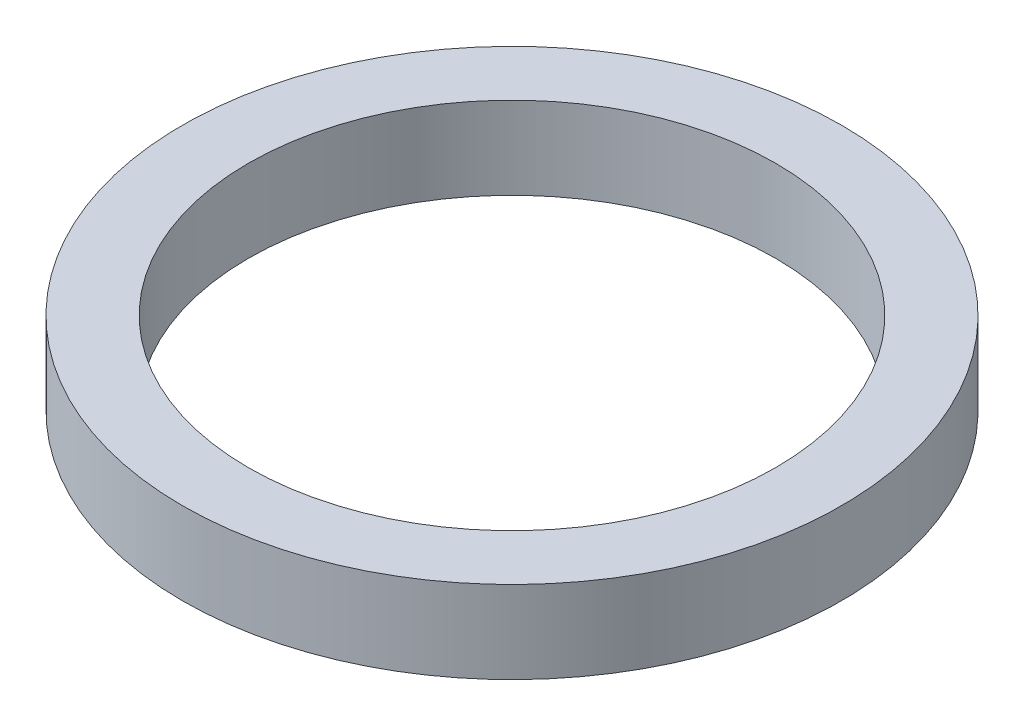
ISO-10303-21;
HEADER;
FILE_DESCRIPTION(('STEP AP214'),'2;1');
FILE_NAME('part.step','',(''),(''),'','','');
FILE_SCHEMA(('AUTOMOTIVE_DESIGN { 1 0 10303 214 1 1 1 1 }'));
ENDSEC;
DATA;
#1=APPLICATION_CONTEXT('core data for automotive mechanical design processes');
#2=APPLICATION_PROTOCOL_DEFINITION('international standard','automotive_design',2000,#1);
#3=PRODUCT_CONTEXT('',#1,'mechanical');
#4=PRODUCT('Part','Part','',(#3));
#5=PRODUCT_RELATED_PRODUCT_CATEGORY('part','',(#4));
#6=PRODUCT_DEFINITION_FORMATION('','',#4);
#7=PRODUCT_DEFINITION_CONTEXT('part definition',#1,'design');
#8=PRODUCT_DEFINITION('design','',#6,#7);
#9=PRODUCT_DEFINITION_SHAPE('','',#8);
#10=(LENGTH_UNIT() NAMED_UNIT(*) SI_UNIT(.MILLI.,.METRE.));
#11=(NAMED_UNIT(*) PLANE_ANGLE_UNIT() SI_UNIT($,.RADIAN.));
#12=(NAMED_UNIT(*) SI_UNIT($,.STERADIAN.) SOLID_ANGLE_UNIT());
#13=UNCERTAINTY_MEASURE_WITH_UNIT(LENGTH_MEASURE(1.E-05),#10,'distance_accuracy_value','');
#14=(GEOMETRIC_REPRESENTATION_CONTEXT(3) GLOBAL_UNCERTAINTY_ASSIGNED_CONTEXT((#13)) GLOBAL_UNIT_ASSIGNED_CONTEXT((#10,
#11,#12)) REPRESENTATION_CONTEXT('',''));
#15=CARTESIAN_POINT('',(0.,0.,0.));
#16=DIRECTION('',(0.,0.,1.));
#17=DIRECTION('',(1.,0.,0.));
#18=AXIS2_PLACEMENT_3D('',#15,#16,#17);
#19=CARTESIAN_POINT('',(0.,0.5,0.));
#20=DIRECTION('',(0.,1.,0.));
#21=DIRECTION('',(0.,0.,1.));
#22=AXIS2_PLACEMENT_3D('',#19,#20,#21);
#23=PLANE('',#22);
#24=CARTESIAN_POINT('',(0.,0.5,0.));
#25=DIRECTION('',(0.,1.,0.));
#26=DIRECTION('',(0.,0.,1.));
#27=AXIS2_PLACEMENT_3D('',#24,#25,#26);
#28=CIRCLE('',#27,2.);
#29=CARTESIAN_POINT('',(0.,0.5,2.));
#30=VERTEX_POINT('',#29);
#31=EDGE_CURVE('E10',#30,#30,#28,.T.);
#32=ORIENTED_EDGE('',*,*,#31,.T.);
#33=EDGE_LOOP('',(#32));
#34=FACE_BOUND('',#33,.T.);
#35=CARTESIAN_POINT('',(0.,0.5,0.));
#36=DIRECTION('',(0.,1.,0.));
#37=DIRECTION('',(0.,0.,1.));
#38=AXIS2_PLACEMENT_3D('',#35,#36,#37);
#39=CIRCLE('',#38,1.6);
#40=CARTESIAN_POINT('',(0.,0.5,1.6));
#41=VERTEX_POINT('',#40);
#42=EDGE_CURVE('E56',#41,#41,#39,.T.);
#43=ORIENTED_EDGE('',*,*,#42,.F.);
#44=EDGE_LOOP('',(#43));
#45=FACE_BOUND('',#44,.T.);
#46=ADVANCED_FACE('F43',(#34,#45),#23,.T.);
#47=CARTESIAN_POINT('',(0.,0.,0.));
#48=DIRECTION('',(0.,1.,0.));
#49=DIRECTION('',(0.,0.,1.));
#50=AXIS2_PLACEMENT_3D('',#47,#48,#49);
#51=PLANE('',#50);
#52=CARTESIAN_POINT('',(0.,0.,0.));
#53=DIRECTION('',(0.,1.,0.));
#54=DIRECTION('',(0.,0.,1.));
#55=AXIS2_PLACEMENT_3D('',#52,#53,#54);
#56=CIRCLE('',#55,2.);
#57=CARTESIAN_POINT('',(0.,0.,2.));
#58=VERTEX_POINT('',#57);
#59=EDGE_CURVE('E47',#58,#58,#56,.T.);
#60=ORIENTED_EDGE('',*,*,#59,.F.);
#61=EDGE_LOOP('',(#60));
#62=FACE_BOUND('',#61,.T.);
#63=CARTESIAN_POINT('',(0.,0.,0.));
#64=DIRECTION('',(0.,1.,0.));
#65=DIRECTION('',(0.,0.,1.));
#66=AXIS2_PLACEMENT_3D('',#63,#64,#65);
#67=CIRCLE('',#66,1.6);
#68=CARTESIAN_POINT('',(0.,0.,1.6));
#69=VERTEX_POINT('',#68);
#70=EDGE_CURVE('E58',#69,#69,#67,.T.);
#71=ORIENTED_EDGE('',*,*,#70,.T.);
#72=EDGE_LOOP('',(#71));
#73=FACE_BOUND('',#72,.T.);
#74=ADVANCED_FACE('F70',(#62,#73),#51,.F.);
#75=CARTESIAN_POINT('',(0.,0.5,0.));
#76=DIRECTION('',(0.,-1.,0.));
#77=DIRECTION('',(0.,0.,-1.));
#78=AXIS2_PLACEMENT_3D('',#75,#76,#77);
#79=CYLINDRICAL_SURFACE('',#78,2.);
#80=ORIENTED_EDGE('',*,*,#31,.F.);
#81=EDGE_LOOP('',(#80));
#82=FACE_BOUND('',#81,.T.);
#83=ORIENTED_EDGE('',*,*,#59,.T.);
#84=EDGE_LOOP('',(#83));
#85=FACE_BOUND('',#84,.T.);
#86=ADVANCED_FACE('F45',(#82,#85),#79,.T.);
#87=CARTESIAN_POINT('',(0.,0.5,0.));
#88=DIRECTION('',(0.,-1.,0.));
#89=DIRECTION('',(0.,0.,-1.));
#90=AXIS2_PLACEMENT_3D('',#87,#88,#89);
#91=CYLINDRICAL_SURFACE('',#90,1.6);
#92=ORIENTED_EDGE('',*,*,#42,.T.);
#93=EDGE_LOOP('',(#92));
#94=FACE_BOUND('',#93,.T.);
#95=ORIENTED_EDGE('',*,*,#70,.F.);
#96=EDGE_LOOP('',(#95));
#97=FACE_BOUND('',#96,.T.);
#98=ADVANCED_FACE('F66',(#94,#97),#91,.F.);
#99=CLOSED_SHELL('',(#46,#74,#86,#98));
#100=MANIFOLD_SOLID_BREP('B2',#99);
#101=ADVANCED_BREP_SHAPE_REPRESENTATION('',(#18,#100),#14);
#102=SHAPE_DEFINITION_REPRESENTATION(#9,#101);
ENDSEC;
END-ISO-10303-21;
